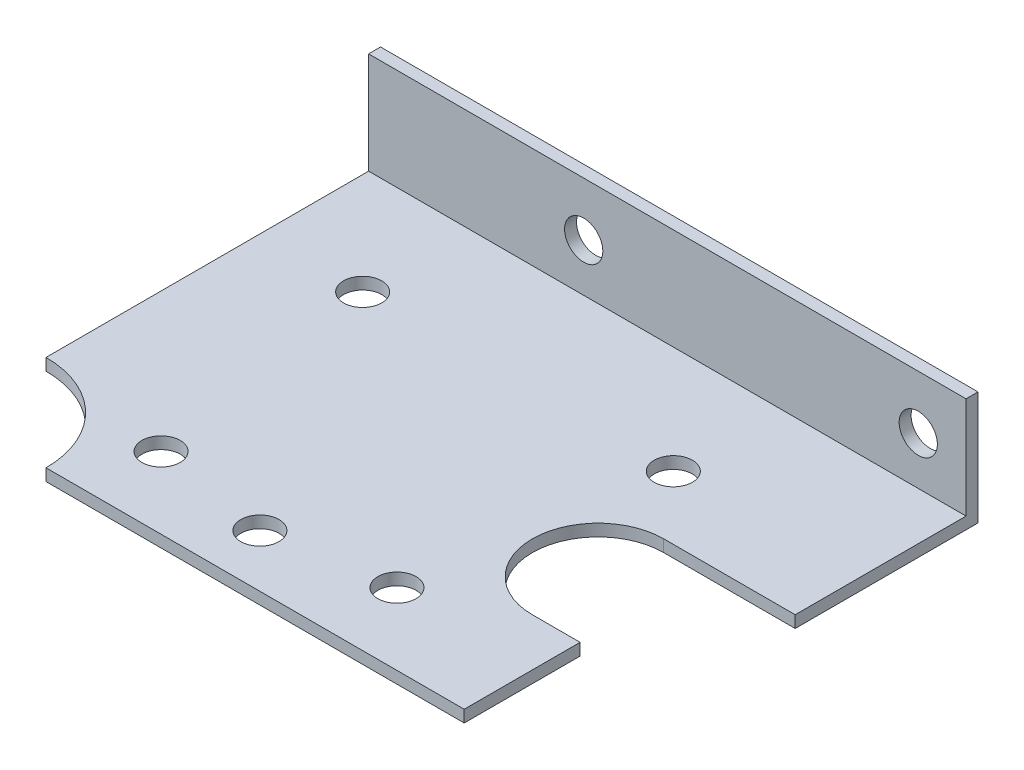
ISO-10303-21;
HEADER;
FILE_DESCRIPTION(('STEP AP214'),'2;1');
FILE_NAME('part.step','',(''),(''),'','','');
FILE_SCHEMA(('AUTOMOTIVE_DESIGN { 1 0 10303 214 1 1 1 1 }'));
ENDSEC;
DATA;
#1=APPLICATION_CONTEXT('core data for automotive mechanical design processes');
#2=APPLICATION_PROTOCOL_DEFINITION('international standard','automotive_design',2000,#1);
#3=PRODUCT_CONTEXT('',#1,'mechanical');
#4=PRODUCT('Part','Part','',(#3));
#5=PRODUCT_RELATED_PRODUCT_CATEGORY('part','',(#4));
#6=PRODUCT_DEFINITION_FORMATION('','',#4);
#7=PRODUCT_DEFINITION_CONTEXT('part definition',#1,'design');
#8=PRODUCT_DEFINITION('design','',#6,#7);
#9=PRODUCT_DEFINITION_SHAPE('','',#8);
#10=(LENGTH_UNIT() NAMED_UNIT(*) SI_UNIT(.MILLI.,.METRE.));
#11=(NAMED_UNIT(*) PLANE_ANGLE_UNIT() SI_UNIT($,.RADIAN.));
#12=(NAMED_UNIT(*) SI_UNIT($,.STERADIAN.) SOLID_ANGLE_UNIT());
#13=UNCERTAINTY_MEASURE_WITH_UNIT(LENGTH_MEASURE(1.E-05),#10,'distance_accuracy_value','');
#14=(GEOMETRIC_REPRESENTATION_CONTEXT(3) GLOBAL_UNCERTAINTY_ASSIGNED_CONTEXT((#13)) GLOBAL_UNIT_ASSIGNED_CONTEXT((#10,
#11,#12)) REPRESENTATION_CONTEXT('',''));
#15=CARTESIAN_POINT('',(0.,0.,0.));
#16=DIRECTION('',(0.,0.,1.));
#17=DIRECTION('',(1.,0.,0.));
#18=AXIS2_PLACEMENT_3D('',#15,#16,#17);
#19=CARTESIAN_POINT('',(0.,1.,0.));
#20=DIRECTION('',(0.,1.,0.));
#21=DIRECTION('',(0.,0.,1.));
#22=AXIS2_PLACEMENT_3D('',#19,#20,#21);
#23=PLANE('',#22);
#24=DIRECTION('',(1.,0.,0.));
#25=VECTOR('',#24,1.);
#26=CARTESIAN_POINT('',(0.,1.,-35.));
#27=LINE('',#26,#25);
#28=CARTESIAN_POINT('',(0.,1.,-35.));
#29=VERTEX_POINT('',#28);
#30=CARTESIAN_POINT('',(50.,1.,-35.));
#31=VERTEX_POINT('',#30);
#32=EDGE_CURVE('E50',#29,#31,#27,.T.);
#33=ORIENTED_EDGE('',*,*,#32,.F.);
#34=DIRECTION('',(0.,0.,1.));
#35=VECTOR('',#34,1.);
#36=CARTESIAN_POINT('',(0.,1.,-8.));
#37=LINE('',#36,#35);
#38=CARTESIAN_POINT('',(0.,1.,-8.));
#39=VERTEX_POINT('',#38);
#40=EDGE_CURVE('E98',#29,#39,#37,.T.);
#41=ORIENTED_EDGE('',*,*,#40,.T.);
#42=CARTESIAN_POINT('',(0.,1.,0.));
#43=DIRECTION('',(0.,-1.,0.));
#44=DIRECTION('',(0.,0.,1.));
#45=AXIS2_PLACEMENT_3D('',#42,#43,#44);
#46=CIRCLE('',#45,8.);
#47=CARTESIAN_POINT('',(8.,1.,0.));
#48=VERTEX_POINT('',#47);
#49=EDGE_CURVE('E198',#39,#48,#46,.T.);
#50=ORIENTED_EDGE('',*,*,#49,.T.);
#51=DIRECTION('',(1.,0.,0.));
#52=VECTOR('',#51,1.);
#53=CARTESIAN_POINT('',(8.,1.,0.));
#54=LINE('',#53,#52);
#55=CARTESIAN_POINT('',(43.,1.,0.));
#56=VERTEX_POINT('',#55);
#57=EDGE_CURVE('E197',#48,#56,#54,.T.);
#58=ORIENTED_EDGE('',*,*,#57,.T.);
#59=DIRECTION('',(0.,0.,-1.));
#60=VECTOR('',#59,1.);
#61=CARTESIAN_POINT('',(43.,1.,0.));
#62=LINE('',#61,#60);
#63=CARTESIAN_POINT('',(43.,1.,-9.70000000000001));
#64=VERTEX_POINT('',#63);
#65=EDGE_CURVE('E119',#56,#64,#62,.T.);
#66=ORIENTED_EDGE('',*,*,#65,.T.);
#67=DIRECTION('',(-1.,0.,0.));
#68=VECTOR('',#67,1.);
#69=CARTESIAN_POINT('',(39.,1.,-9.70000000000001));
#70=LINE('',#69,#68);
#71=CARTESIAN_POINT('',(39.,1.,-9.70000000000001));
#72=VERTEX_POINT('',#71);
#73=EDGE_CURVE('E112',#64,#72,#70,.T.);
#74=ORIENTED_EDGE('',*,*,#73,.T.);
#75=CARTESIAN_POINT('',(39.,1.,-15.2));
#76=DIRECTION('',(0.,-1.,0.));
#77=DIRECTION('',(0.,0.,-1.));
#78=AXIS2_PLACEMENT_3D('',#75,#76,#77);
#79=CIRCLE('',#78,5.49999999999999);
#80=CARTESIAN_POINT('',(39.,1.,-20.7));
#81=VERTEX_POINT('',#80);
#82=EDGE_CURVE('E116',#72,#81,#79,.T.);
#83=ORIENTED_EDGE('',*,*,#82,.T.);
#84=DIRECTION('',(1.,0.,0.));
#85=VECTOR('',#84,1.);
#86=CARTESIAN_POINT('',(39.,1.,-20.7));
#87=LINE('',#86,#85);
#88=CARTESIAN_POINT('',(50.,1.,-20.7));
#89=VERTEX_POINT('',#88);
#90=EDGE_CURVE('E57',#81,#89,#87,.T.);
#91=ORIENTED_EDGE('',*,*,#90,.T.);
#92=DIRECTION('',(0.,0.,-1.));
#93=VECTOR('',#92,1.);
#94=CARTESIAN_POINT('',(50.,1.,-20.7));
#95=LINE('',#94,#93);
#96=EDGE_CURVE('E158',#89,#31,#95,.T.);
#97=ORIENTED_EDGE('',*,*,#96,.T.);
#98=EDGE_LOOP('',(#33,#41,#50,#58,#66,#74,#83,#91,#97));
#99=FACE_BOUND('',#98,.T.);
#100=CARTESIAN_POINT('',(31.3711701434025,1.,-6.));
#101=DIRECTION('',(0.,1.,0.));
#102=DIRECTION('',(0.,0.,1.));
#103=AXIS2_PLACEMENT_3D('',#100,#101,#102);
#104=CIRCLE('',#103,1.60000000000001);
#105=CARTESIAN_POINT('',(31.3711701434025,1.,-4.39999999999999));
#106=VERTEX_POINT('',#105);
#107=EDGE_CURVE('E219',#106,#106,#104,.T.);
#108=ORIENTED_EDGE('',*,*,#107,.F.);
#109=EDGE_LOOP('',(#108));
#110=FACE_BOUND('',#109,.T.);
#111=CARTESIAN_POINT('',(21.5,1.,-4.39999999999999));
#112=DIRECTION('',(0.,1.,0.));
#113=DIRECTION('',(0.,0.,1.));
#114=AXIS2_PLACEMENT_3D('',#111,#112,#113);
#115=CIRCLE('',#114,1.6);
#116=CARTESIAN_POINT('',(21.5,1.,-2.79999999999999));
#117=VERTEX_POINT('',#116);
#118=EDGE_CURVE('E207',#117,#117,#115,.T.);
#119=ORIENTED_EDGE('',*,*,#118,.F.);
#120=EDGE_LOOP('',(#119));
#121=FACE_BOUND('',#120,.T.);
#122=CARTESIAN_POINT('',(8.5,1.,-26.));
#123=DIRECTION('',(0.,1.,0.));
#124=DIRECTION('',(0.,0.,1.));
#125=AXIS2_PLACEMENT_3D('',#122,#123,#124);
#126=CIRCLE('',#125,1.6);
#127=CARTESIAN_POINT('',(8.5,1.,-24.4));
#128=VERTEX_POINT('',#127);
#129=EDGE_CURVE('E144',#128,#128,#126,.T.);
#130=ORIENTED_EDGE('',*,*,#129,.F.);
#131=EDGE_LOOP('',(#130));
#132=FACE_BOUND('',#131,.T.);
#133=CARTESIAN_POINT('',(34.5,1.,-26.));
#134=DIRECTION('',(0.,1.,0.));
#135=DIRECTION('',(0.,0.,-1.));
#136=AXIS2_PLACEMENT_3D('',#133,#134,#135);
#137=CIRCLE('',#136,1.6);
#138=CARTESIAN_POINT('',(34.5,1.,-27.6));
#139=VERTEX_POINT('',#138);
#140=EDGE_CURVE('E213',#139,#139,#137,.T.);
#141=ORIENTED_EDGE('',*,*,#140,.F.);
#142=EDGE_LOOP('',(#141));
#143=FACE_BOUND('',#142,.T.);
#144=CARTESIAN_POINT('',(11.6288298565975,1.,-5.99999999999999));
#145=DIRECTION('',(0.,1.,0.));
#146=DIRECTION('',(0.,0.,-1.));
#147=AXIS2_PLACEMENT_3D('',#144,#145,#146);
#148=CIRCLE('',#147,1.6);
#149=CARTESIAN_POINT('',(11.6288298565975,1.,-7.6));
#150=VERTEX_POINT('',#149);
#151=EDGE_CURVE('E225',#150,#150,#148,.T.);
#152=ORIENTED_EDGE('',*,*,#151,.F.);
#153=EDGE_LOOP('',(#152));
#154=FACE_BOUND('',#153,.T.);
#155=ADVANCED_FACE('F35',(#99,#110,#121,#132,#143,#154),#23,.T.);
#156=CARTESIAN_POINT('',(0.,0.,0.));
#157=DIRECTION('',(0.,1.,0.));
#158=DIRECTION('',(0.,0.,1.));
#159=AXIS2_PLACEMENT_3D('',#156,#157,#158);
#160=PLANE('',#159);
#161=DIRECTION('',(0.,0.,-1.));
#162=VECTOR('',#161,1.);
#163=CARTESIAN_POINT('',(50.,0.,-20.7));
#164=LINE('',#163,#162);
#165=CARTESIAN_POINT('',(50.,0.,-20.7));
#166=VERTEX_POINT('',#165);
#167=CARTESIAN_POINT('',(50.,0.,-36.));
#168=VERTEX_POINT('',#167);
#169=EDGE_CURVE('E140',#166,#168,#164,.T.);
#170=ORIENTED_EDGE('',*,*,#169,.F.);
#171=DIRECTION('',(1.,0.,0.));
#172=VECTOR('',#171,1.);
#173=CARTESIAN_POINT('',(39.,0.,-20.7));
#174=LINE('',#173,#172);
#175=CARTESIAN_POINT('',(39.,0.,-20.7));
#176=VERTEX_POINT('',#175);
#177=EDGE_CURVE('E93',#176,#166,#174,.T.);
#178=ORIENTED_EDGE('',*,*,#177,.F.);
#179=CARTESIAN_POINT('',(39.,0.,-15.2));
#180=DIRECTION('',(0.,-1.,0.));
#181=DIRECTION('',(0.,0.,-1.));
#182=AXIS2_PLACEMENT_3D('',#179,#180,#181);
#183=CIRCLE('',#182,5.49999999999999);
#184=CARTESIAN_POINT('',(39.,0.,-9.70000000000001));
#185=VERTEX_POINT('',#184);
#186=EDGE_CURVE('E155',#185,#176,#183,.T.);
#187=ORIENTED_EDGE('',*,*,#186,.F.);
#188=DIRECTION('',(-1.,0.,0.));
#189=VECTOR('',#188,1.);
#190=CARTESIAN_POINT('',(39.,0.,-9.70000000000001));
#191=LINE('',#190,#189);
#192=CARTESIAN_POINT('',(43.,0.,-9.70000000000001));
#193=VERTEX_POINT('',#192);
#194=EDGE_CURVE('E128',#193,#185,#191,.T.);
#195=ORIENTED_EDGE('',*,*,#194,.F.);
#196=DIRECTION('',(0.,0.,-1.));
#197=VECTOR('',#196,1.);
#198=CARTESIAN_POINT('',(43.,0.,0.));
#199=LINE('',#198,#197);
#200=CARTESIAN_POINT('',(43.,0.,0.));
#201=VERTEX_POINT('',#200);
#202=EDGE_CURVE('E152',#201,#193,#199,.T.);
#203=ORIENTED_EDGE('',*,*,#202,.F.);
#204=DIRECTION('',(1.,0.,0.));
#205=VECTOR('',#204,1.);
#206=CARTESIAN_POINT('',(8.,0.,0.));
#207=LINE('',#206,#205);
#208=CARTESIAN_POINT('',(8.,0.,0.));
#209=VERTEX_POINT('',#208);
#210=EDGE_CURVE('E150',#209,#201,#207,.T.);
#211=ORIENTED_EDGE('',*,*,#210,.F.);
#212=CARTESIAN_POINT('',(0.,0.,0.));
#213=DIRECTION('',(0.,-1.,0.));
#214=DIRECTION('',(0.,0.,1.));
#215=AXIS2_PLACEMENT_3D('',#212,#213,#214);
#216=CIRCLE('',#215,8.);
#217=CARTESIAN_POINT('',(0.,0.,-8.));
#218=VERTEX_POINT('',#217);
#219=EDGE_CURVE('E148',#218,#209,#216,.T.);
#220=ORIENTED_EDGE('',*,*,#219,.F.);
#221=DIRECTION('',(0.,0.,1.));
#222=VECTOR('',#221,1.);
#223=CARTESIAN_POINT('',(0.,0.,-8.));
#224=LINE('',#223,#222);
#225=CARTESIAN_POINT('',(0.,0.,-36.));
#226=VERTEX_POINT('',#225);
#227=EDGE_CURVE('E146',#226,#218,#224,.T.);
#228=ORIENTED_EDGE('',*,*,#227,.F.);
#229=DIRECTION('',(-1.,0.,0.));
#230=VECTOR('',#229,1.);
#231=CARTESIAN_POINT('',(0.,0.,-36.));
#232=LINE('',#231,#230);
#233=EDGE_CURVE('E143',#168,#226,#232,.T.);
#234=ORIENTED_EDGE('',*,*,#233,.F.);
#235=EDGE_LOOP('',(#170,#178,#187,#195,#203,#211,#220,#228,#234));
#236=FACE_BOUND('',#235,.T.);
#237=CARTESIAN_POINT('',(8.5,0.,-26.));
#238=DIRECTION('',(0.,1.,0.));
#239=DIRECTION('',(0.,0.,1.));
#240=AXIS2_PLACEMENT_3D('',#237,#238,#239);
#241=CIRCLE('',#240,1.6);
#242=CARTESIAN_POINT('',(8.5,0.,-24.4));
#243=VERTEX_POINT('',#242);
#244=EDGE_CURVE('E204',#243,#243,#241,.T.);
#245=ORIENTED_EDGE('',*,*,#244,.T.);
#246=EDGE_LOOP('',(#245));
#247=FACE_BOUND('',#246,.T.);
#248=CARTESIAN_POINT('',(21.5,0.,-4.39999999999999));
#249=DIRECTION('',(0.,1.,0.));
#250=DIRECTION('',(0.,0.,1.));
#251=AXIS2_PLACEMENT_3D('',#248,#249,#250);
#252=CIRCLE('',#251,1.6);
#253=CARTESIAN_POINT('',(21.5,0.,-2.79999999999999));
#254=VERTEX_POINT('',#253);
#255=EDGE_CURVE('E210',#254,#254,#252,.T.);
#256=ORIENTED_EDGE('',*,*,#255,.T.);
#257=EDGE_LOOP('',(#256));
#258=FACE_BOUND('',#257,.T.);
#259=CARTESIAN_POINT('',(34.5,0.,-26.));
#260=DIRECTION('',(0.,1.,0.));
#261=DIRECTION('',(0.,0.,-1.));
#262=AXIS2_PLACEMENT_3D('',#259,#260,#261);
#263=CIRCLE('',#262,1.6);
#264=CARTESIAN_POINT('',(34.5,0.,-27.6));
#265=VERTEX_POINT('',#264);
#266=EDGE_CURVE('E216',#265,#265,#263,.T.);
#267=ORIENTED_EDGE('',*,*,#266,.T.);
#268=EDGE_LOOP('',(#267));
#269=FACE_BOUND('',#268,.T.);
#270=CARTESIAN_POINT('',(31.3711701434025,0.,-6.));
#271=DIRECTION('',(0.,1.,0.));
#272=DIRECTION('',(0.,0.,1.));
#273=AXIS2_PLACEMENT_3D('',#270,#271,#272);
#274=CIRCLE('',#273,1.60000000000001);
#275=CARTESIAN_POINT('',(31.3711701434025,0.,-4.39999999999999));
#276=VERTEX_POINT('',#275);
#277=EDGE_CURVE('E222',#276,#276,#274,.T.);
#278=ORIENTED_EDGE('',*,*,#277,.T.);
#279=EDGE_LOOP('',(#278));
#280=FACE_BOUND('',#279,.T.);
#281=CARTESIAN_POINT('',(11.6288298565975,0.,-5.99999999999999));
#282=DIRECTION('',(0.,1.,0.));
#283=DIRECTION('',(0.,0.,-1.));
#284=AXIS2_PLACEMENT_3D('',#281,#282,#283);
#285=CIRCLE('',#284,1.6);
#286=CARTESIAN_POINT('',(11.6288298565975,0.,-7.6));
#287=VERTEX_POINT('',#286);
#288=EDGE_CURVE('E228',#287,#287,#285,.T.);
#289=ORIENTED_EDGE('',*,*,#288,.T.);
#290=EDGE_LOOP('',(#289));
#291=FACE_BOUND('',#290,.T.);
#292=ADVANCED_FACE('F185',(#236,#247,#258,#269,#280,#291),#160,.F.);
#293=CARTESIAN_POINT('',(50.,1.,-20.7));
#294=DIRECTION('',(-1.,0.,0.));
#295=DIRECTION('',(0.,0.,1.));
#296=AXIS2_PLACEMENT_3D('',#293,#294,#295);
#297=PLANE('',#296);
#298=ORIENTED_EDGE('',*,*,#169,.T.);
#299=DIRECTION('',(0.,-1.,0.));
#300=VECTOR('',#299,1.);
#301=CARTESIAN_POINT('',(50.,1.,-36.));
#302=LINE('',#301,#300);
#303=CARTESIAN_POINT('',(50.,9.5,-36.));
#304=VERTEX_POINT('',#303);
#305=EDGE_CURVE('E11',#304,#168,#302,.T.);
#306=ORIENTED_EDGE('',*,*,#305,.F.);
#307=DIRECTION('',(0.,0.,-1.));
#308=VECTOR('',#307,1.);
#309=CARTESIAN_POINT('',(50.,9.5,-36.));
#310=LINE('',#309,#308);
#311=CARTESIAN_POINT('',(50.,9.5,-35.));
#312=VERTEX_POINT('',#311);
#313=EDGE_CURVE('E243',#312,#304,#310,.T.);
#314=ORIENTED_EDGE('',*,*,#313,.F.);
#315=DIRECTION('',(0.,-1.,0.));
#316=VECTOR('',#315,1.);
#317=CARTESIAN_POINT('',(50.,9.5,-35.));
#318=LINE('',#317,#316);
#319=EDGE_CURVE('E236',#312,#31,#318,.T.);
#320=ORIENTED_EDGE('',*,*,#319,.T.);
#321=ORIENTED_EDGE('',*,*,#96,.F.);
#322=DIRECTION('',(0.,-1.,0.));
#323=VECTOR('',#322,1.);
#324=CARTESIAN_POINT('',(50.,1.,-20.7));
#325=LINE('',#324,#323);
#326=EDGE_CURVE('E136',#89,#166,#325,.T.);
#327=ORIENTED_EDGE('',*,*,#326,.T.);
#328=EDGE_LOOP('',(#298,#306,#314,#320,#321,#327));
#329=FACE_BOUND('',#328,.T.);
#330=ADVANCED_FACE('F37',(#329),#297,.F.);
#331=CARTESIAN_POINT('',(0.,1.,-36.));
#332=DIRECTION('',(0.,0.,1.));
#333=DIRECTION('',(1.,0.,0.));
#334=AXIS2_PLACEMENT_3D('',#331,#332,#333);
#335=PLANE('',#334);
#336=CARTESIAN_POINT('',(46.,5.,-36.));
#337=DIRECTION('',(0.,0.,1.));
#338=DIRECTION('',(1.,0.,0.));
#339=AXIS2_PLACEMENT_3D('',#336,#337,#338);
#340=CIRCLE('',#339,1.6);
#341=CARTESIAN_POINT('',(47.6,5.,-36.));
#342=VERTEX_POINT('',#341);
#343=EDGE_CURVE('E241',#342,#342,#340,.T.);
#344=ORIENTED_EDGE('',*,*,#343,.T.);
#345=EDGE_LOOP('',(#344));
#346=FACE_BOUND('',#345,.T.);
#347=CARTESIAN_POINT('',(18.,5.,-36.));
#348=DIRECTION('',(0.,0.,1.));
#349=DIRECTION('',(1.,0.,0.));
#350=AXIS2_PLACEMENT_3D('',#347,#348,#349);
#351=CIRCLE('',#350,1.6);
#352=CARTESIAN_POINT('',(19.6,5.,-36.));
#353=VERTEX_POINT('',#352);
#354=EDGE_CURVE('E252',#353,#353,#351,.T.);
#355=ORIENTED_EDGE('',*,*,#354,.T.);
#356=EDGE_LOOP('',(#355));
#357=FACE_BOUND('',#356,.T.);
#358=ORIENTED_EDGE('',*,*,#233,.T.);
#359=DIRECTION('',(0.,-1.,0.));
#360=VECTOR('',#359,1.);
#361=CARTESIAN_POINT('',(0.,1.,-36.));
#362=LINE('',#361,#360);
#363=CARTESIAN_POINT('',(0.,9.5,-36.));
#364=VERTEX_POINT('',#363);
#365=EDGE_CURVE('E43',#364,#226,#362,.T.);
#366=ORIENTED_EDGE('',*,*,#365,.F.);
#367=DIRECTION('',(-1.,0.,0.));
#368=VECTOR('',#367,1.);
#369=CARTESIAN_POINT('',(0.,9.5,-36.));
#370=LINE('',#369,#368);
#371=EDGE_CURVE('E239',#304,#364,#370,.T.);
#372=ORIENTED_EDGE('',*,*,#371,.F.);
#373=ORIENTED_EDGE('',*,*,#305,.T.);
#374=EDGE_LOOP('',(#358,#366,#372,#373));
#375=FACE_BOUND('',#374,.T.);
#376=ADVANCED_FACE('F285',(#346,#357,#375),#335,.F.);
#377=CARTESIAN_POINT('',(0.,1.,-8.));
#378=DIRECTION('',(1.,0.,0.));
#379=DIRECTION('',(0.,0.,-1.));
#380=AXIS2_PLACEMENT_3D('',#377,#378,#379);
#381=PLANE('',#380);
#382=ORIENTED_EDGE('',*,*,#227,.T.);
#383=DIRECTION('',(0.,-1.,0.));
#384=VECTOR('',#383,1.);
#385=CARTESIAN_POINT('',(0.,1.,-8.));
#386=LINE('',#385,#384);
#387=EDGE_CURVE('E168',#39,#218,#386,.T.);
#388=ORIENTED_EDGE('',*,*,#387,.F.);
#389=ORIENTED_EDGE('',*,*,#40,.F.);
#390=DIRECTION('',(0.,-1.,0.));
#391=VECTOR('',#390,1.);
#392=CARTESIAN_POINT('',(0.,9.5,-35.));
#393=LINE('',#392,#391);
#394=CARTESIAN_POINT('',(0.,9.5,-35.));
#395=VERTEX_POINT('',#394);
#396=EDGE_CURVE('E231',#395,#29,#393,.T.);
#397=ORIENTED_EDGE('',*,*,#396,.F.);
#398=DIRECTION('',(0.,0.,1.));
#399=VECTOR('',#398,1.);
#400=CARTESIAN_POINT('',(0.,9.5,-36.));
#401=LINE('',#400,#399);
#402=EDGE_CURVE('E178',#364,#395,#401,.T.);
#403=ORIENTED_EDGE('',*,*,#402,.F.);
#404=ORIENTED_EDGE('',*,*,#365,.T.);
#405=EDGE_LOOP('',(#382,#388,#389,#397,#403,#404));
#406=FACE_BOUND('',#405,.T.);
#407=ADVANCED_FACE('F175',(#406),#381,.F.);
#408=CARTESIAN_POINT('',(0.,1.,0.));
#409=DIRECTION('',(0.,-1.,0.));
#410=DIRECTION('',(0.,0.,-1.));
#411=AXIS2_PLACEMENT_3D('',#408,#409,#410);
#412=CYLINDRICAL_SURFACE('',#411,8.);
#413=ORIENTED_EDGE('',*,*,#219,.T.);
#414=DIRECTION('',(0.,-1.,0.));
#415=VECTOR('',#414,1.);
#416=CARTESIAN_POINT('',(8.,1.,0.));
#417=LINE('',#416,#415);
#418=EDGE_CURVE('E165',#48,#209,#417,.T.);
#419=ORIENTED_EDGE('',*,*,#418,.F.);
#420=ORIENTED_EDGE('',*,*,#49,.F.);
#421=ORIENTED_EDGE('',*,*,#387,.T.);
#422=EDGE_LOOP('',(#413,#419,#420,#421));
#423=FACE_BOUND('',#422,.T.);
#424=ADVANCED_FACE('F191',(#423),#412,.F.);
#425=CARTESIAN_POINT('',(8.,1.,0.));
#426=DIRECTION('',(0.,0.,-1.));
#427=DIRECTION('',(-1.,0.,0.));
#428=AXIS2_PLACEMENT_3D('',#425,#426,#427);
#429=PLANE('',#428);
#430=ORIENTED_EDGE('',*,*,#210,.T.);
#431=DIRECTION('',(0.,-1.,0.));
#432=VECTOR('',#431,1.);
#433=CARTESIAN_POINT('',(43.,1.,0.));
#434=LINE('',#433,#432);
#435=EDGE_CURVE('E162',#56,#201,#434,.T.);
#436=ORIENTED_EDGE('',*,*,#435,.F.);
#437=ORIENTED_EDGE('',*,*,#57,.F.);
#438=ORIENTED_EDGE('',*,*,#418,.T.);
#439=EDGE_LOOP('',(#430,#436,#437,#438));
#440=FACE_BOUND('',#439,.T.);
#441=ADVANCED_FACE('F195',(#440),#429,.F.);
#442=CARTESIAN_POINT('',(43.,1.,0.));
#443=DIRECTION('',(-1.,0.,0.));
#444=DIRECTION('',(0.,0.,1.));
#445=AXIS2_PLACEMENT_3D('',#442,#443,#444);
#446=PLANE('',#445);
#447=ORIENTED_EDGE('',*,*,#202,.T.);
#448=DIRECTION('',(0.,-1.,0.));
#449=VECTOR('',#448,1.);
#450=CARTESIAN_POINT('',(43.,1.,-9.70000000000001));
#451=LINE('',#450,#449);
#452=EDGE_CURVE('E131',#64,#193,#451,.T.);
#453=ORIENTED_EDGE('',*,*,#452,.F.);
#454=ORIENTED_EDGE('',*,*,#65,.F.);
#455=ORIENTED_EDGE('',*,*,#435,.T.);
#456=EDGE_LOOP('',(#447,#453,#454,#455));
#457=FACE_BOUND('',#456,.T.);
#458=ADVANCED_FACE('F381',(#457),#446,.F.);
#459=CARTESIAN_POINT('',(39.,1.,-9.70000000000001));
#460=DIRECTION('',(0.,0.,1.));
#461=DIRECTION('',(1.,0.,0.));
#462=AXIS2_PLACEMENT_3D('',#459,#460,#461);
#463=PLANE('',#462);
#464=ORIENTED_EDGE('',*,*,#194,.T.);
#465=DIRECTION('',(0.,-1.,0.));
#466=VECTOR('',#465,1.);
#467=CARTESIAN_POINT('',(39.,1.,-9.70000000000001));
#468=LINE('',#467,#466);
#469=EDGE_CURVE('E125',#72,#185,#468,.T.);
#470=ORIENTED_EDGE('',*,*,#469,.F.);
#471=ORIENTED_EDGE('',*,*,#73,.F.);
#472=ORIENTED_EDGE('',*,*,#452,.T.);
#473=EDGE_LOOP('',(#464,#470,#471,#472));
#474=FACE_BOUND('',#473,.T.);
#475=ADVANCED_FACE('F126',(#474),#463,.F.);
#476=CARTESIAN_POINT('',(39.,1.,-15.2));
#477=DIRECTION('',(0.,-1.,0.));
#478=DIRECTION('',(0.,0.,-1.));
#479=AXIS2_PLACEMENT_3D('',#476,#477,#478);
#480=CYLINDRICAL_SURFACE('',#479,5.49999999999999);
#481=ORIENTED_EDGE('',*,*,#186,.T.);
#482=DIRECTION('',(0.,-1.,0.));
#483=VECTOR('',#482,1.);
#484=CARTESIAN_POINT('',(39.,1.,-20.7));
#485=LINE('',#484,#483);
#486=EDGE_CURVE('E132',#81,#176,#485,.T.);
#487=ORIENTED_EDGE('',*,*,#486,.F.);
#488=ORIENTED_EDGE('',*,*,#82,.F.);
#489=ORIENTED_EDGE('',*,*,#469,.T.);
#490=EDGE_LOOP('',(#481,#487,#488,#489));
#491=FACE_BOUND('',#490,.T.);
#492=ADVANCED_FACE('F134',(#491),#480,.F.);
#493=CARTESIAN_POINT('',(39.,1.,-20.7));
#494=DIRECTION('',(0.,0.,-1.));
#495=DIRECTION('',(-1.,0.,0.));
#496=AXIS2_PLACEMENT_3D('',#493,#494,#495);
#497=PLANE('',#496);
#498=ORIENTED_EDGE('',*,*,#177,.T.);
#499=ORIENTED_EDGE('',*,*,#326,.F.);
#500=ORIENTED_EDGE('',*,*,#90,.F.);
#501=ORIENTED_EDGE('',*,*,#486,.T.);
#502=EDGE_LOOP('',(#498,#499,#500,#501));
#503=FACE_BOUND('',#502,.T.);
#504=ADVANCED_FACE('F286',(#503),#497,.F.);
#505=CARTESIAN_POINT('',(8.5,1.,-26.));
#506=DIRECTION('',(0.,-1.,0.));
#507=DIRECTION('',(0.,0.,-1.));
#508=AXIS2_PLACEMENT_3D('',#505,#506,#507);
#509=CYLINDRICAL_SURFACE('',#508,1.6);
#510=ORIENTED_EDGE('',*,*,#129,.T.);
#511=EDGE_LOOP('',(#510));
#512=FACE_BOUND('',#511,.T.);
#513=ORIENTED_EDGE('',*,*,#244,.F.);
#514=EDGE_LOOP('',(#513));
#515=FACE_BOUND('',#514,.T.);
#516=ADVANCED_FACE('F288',(#512,#515),#509,.F.);
#517=CARTESIAN_POINT('',(21.5,1.,-4.39999999999999));
#518=DIRECTION('',(0.,-1.,0.));
#519=DIRECTION('',(0.,0.,-1.));
#520=AXIS2_PLACEMENT_3D('',#517,#518,#519);
#521=CYLINDRICAL_SURFACE('',#520,1.6);
#522=ORIENTED_EDGE('',*,*,#118,.T.);
#523=EDGE_LOOP('',(#522));
#524=FACE_BOUND('',#523,.T.);
#525=ORIENTED_EDGE('',*,*,#255,.F.);
#526=EDGE_LOOP('',(#525));
#527=FACE_BOUND('',#526,.T.);
#528=ADVANCED_FACE('F294',(#524,#527),#521,.F.);
#529=CARTESIAN_POINT('',(34.5,1.,-26.));
#530=DIRECTION('',(0.,-1.,0.));
#531=DIRECTION('',(0.,0.,-1.));
#532=AXIS2_PLACEMENT_3D('',#529,#530,#531);
#533=CYLINDRICAL_SURFACE('',#532,1.6);
#534=ORIENTED_EDGE('',*,*,#140,.T.);
#535=EDGE_LOOP('',(#534));
#536=FACE_BOUND('',#535,.T.);
#537=ORIENTED_EDGE('',*,*,#266,.F.);
#538=EDGE_LOOP('',(#537));
#539=FACE_BOUND('',#538,.T.);
#540=ADVANCED_FACE('F307',(#536,#539),#533,.F.);
#541=CARTESIAN_POINT('',(31.3711701434025,1.,-6.));
#542=DIRECTION('',(0.,-1.,0.));
#543=DIRECTION('',(0.,0.,-1.));
#544=AXIS2_PLACEMENT_3D('',#541,#542,#543);
#545=CYLINDRICAL_SURFACE('',#544,1.60000000000001);
#546=ORIENTED_EDGE('',*,*,#107,.T.);
#547=EDGE_LOOP('',(#546));
#548=FACE_BOUND('',#547,.T.);
#549=ORIENTED_EDGE('',*,*,#277,.F.);
#550=EDGE_LOOP('',(#549));
#551=FACE_BOUND('',#550,.T.);
#552=ADVANCED_FACE('F311',(#548,#551),#545,.F.);
#553=CARTESIAN_POINT('',(11.6288298565975,1.,-5.99999999999999));
#554=DIRECTION('',(0.,-1.,0.));
#555=DIRECTION('',(0.,0.,-1.));
#556=AXIS2_PLACEMENT_3D('',#553,#554,#555);
#557=CYLINDRICAL_SURFACE('',#556,1.6);
#558=ORIENTED_EDGE('',*,*,#151,.T.);
#559=EDGE_LOOP('',(#558));
#560=FACE_BOUND('',#559,.T.);
#561=ORIENTED_EDGE('',*,*,#288,.F.);
#562=EDGE_LOOP('',(#561));
#563=FACE_BOUND('',#562,.T.);
#564=ADVANCED_FACE('F269',(#560,#563),#557,.F.);
#565=CARTESIAN_POINT('',(0.,9.5,-35.));
#566=DIRECTION('',(0.,0.,-1.));
#567=DIRECTION('',(-1.,0.,0.));
#568=AXIS2_PLACEMENT_3D('',#565,#566,#567);
#569=PLANE('',#568);
#570=CARTESIAN_POINT('',(46.,5.,-35.));
#571=DIRECTION('',(0.,0.,1.));
#572=DIRECTION('',(1.,0.,0.));
#573=AXIS2_PLACEMENT_3D('',#570,#571,#572);
#574=CIRCLE('',#573,1.6);
#575=CARTESIAN_POINT('',(47.6,5.,-35.));
#576=VERTEX_POINT('',#575);
#577=EDGE_CURVE('E255',#576,#576,#574,.T.);
#578=ORIENTED_EDGE('',*,*,#577,.F.);
#579=EDGE_LOOP('',(#578));
#580=FACE_BOUND('',#579,.T.);
#581=CARTESIAN_POINT('',(18.,5.,-35.));
#582=DIRECTION('',(0.,0.,1.));
#583=DIRECTION('',(1.,0.,0.));
#584=AXIS2_PLACEMENT_3D('',#581,#582,#583);
#585=CIRCLE('',#584,1.6);
#586=CARTESIAN_POINT('',(19.6,5.,-35.));
#587=VERTEX_POINT('',#586);
#588=EDGE_CURVE('E256',#587,#587,#585,.T.);
#589=ORIENTED_EDGE('',*,*,#588,.F.);
#590=EDGE_LOOP('',(#589));
#591=FACE_BOUND('',#590,.T.);
#592=ORIENTED_EDGE('',*,*,#32,.T.);
#593=ORIENTED_EDGE('',*,*,#319,.F.);
#594=DIRECTION('',(1.,0.,0.));
#595=VECTOR('',#594,1.);
#596=CARTESIAN_POINT('',(0.,9.5,-35.));
#597=LINE('',#596,#595);
#598=EDGE_CURVE('E246',#395,#312,#597,.T.);
#599=ORIENTED_EDGE('',*,*,#598,.F.);
#600=ORIENTED_EDGE('',*,*,#396,.T.);
#601=EDGE_LOOP('',(#592,#593,#599,#600));
#602=FACE_BOUND('',#601,.T.);
#603=ADVANCED_FACE('F265',(#580,#591,#602),#569,.F.);
#604=CARTESIAN_POINT('',(0.,9.5,0.));
#605=DIRECTION('',(0.,1.,0.));
#606=DIRECTION('',(0.,0.,1.));
#607=AXIS2_PLACEMENT_3D('',#604,#605,#606);
#608=PLANE('',#607);
#609=ORIENTED_EDGE('',*,*,#402,.T.);
#610=ORIENTED_EDGE('',*,*,#598,.T.);
#611=ORIENTED_EDGE('',*,*,#313,.T.);
#612=ORIENTED_EDGE('',*,*,#371,.T.);
#613=EDGE_LOOP('',(#609,#610,#611,#612));
#614=FACE_BOUND('',#613,.T.);
#615=ADVANCED_FACE('F268',(#614),#608,.T.);
#616=CARTESIAN_POINT('',(18.,5.,-45.));
#617=DIRECTION('',(0.,0.,1.));
#618=DIRECTION('',(1.,0.,0.));
#619=AXIS2_PLACEMENT_3D('',#616,#617,#618);
#620=CYLINDRICAL_SURFACE('',#619,1.6);
#621=ORIENTED_EDGE('',*,*,#588,.T.);
#622=EDGE_LOOP('',(#621));
#623=FACE_BOUND('',#622,.T.);
#624=ORIENTED_EDGE('',*,*,#354,.F.);
#625=EDGE_LOOP('',(#624));
#626=FACE_BOUND('',#625,.T.);
#627=ADVANCED_FACE('F321',(#623,#626),#620,.F.);
#628=CARTESIAN_POINT('',(46.,5.,-45.));
#629=DIRECTION('',(0.,0.,1.));
#630=DIRECTION('',(1.,0.,0.));
#631=AXIS2_PLACEMENT_3D('',#628,#629,#630);
#632=CYLINDRICAL_SURFACE('',#631,1.6);
#633=ORIENTED_EDGE('',*,*,#577,.T.);
#634=EDGE_LOOP('',(#633));
#635=FACE_BOUND('',#634,.T.);
#636=ORIENTED_EDGE('',*,*,#343,.F.);
#637=EDGE_LOOP('',(#636));
#638=FACE_BOUND('',#637,.T.);
#639=ADVANCED_FACE('F262',(#635,#638),#632,.F.);
#640=CLOSED_SHELL('',(#155,#292,#330,#376,#407,#424,#441,#458,#475,#492,#504,#516,#528,#540,
#552,#564,#603,#615,#627,#639));
#641=MANIFOLD_SOLID_BREP('B2',#640);
#642=ADVANCED_BREP_SHAPE_REPRESENTATION('',(#18,#641),#14);
#643=SHAPE_DEFINITION_REPRESENTATION(#9,#642);
ENDSEC;
END-ISO-10303-21;
